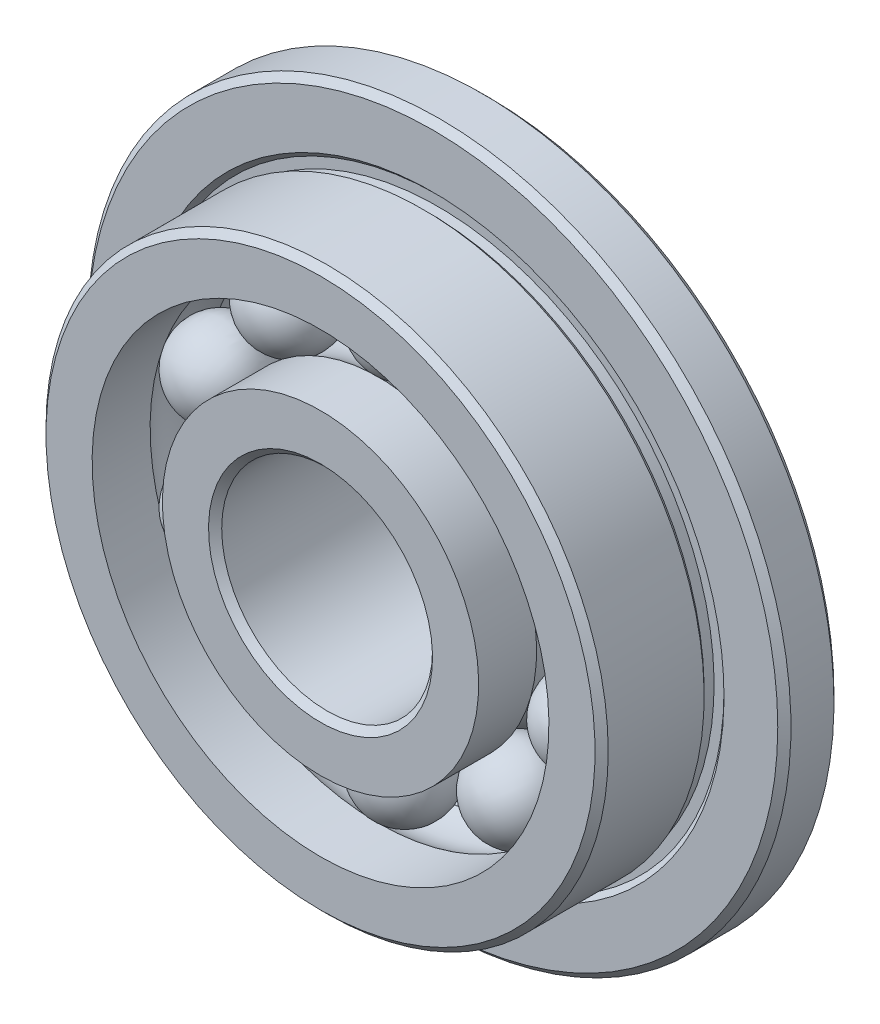
ISO-10303-21;
HEADER;
FILE_DESCRIPTION(('STEP AP214'),'2;1');
FILE_NAME('part.step','',(''),(''),'','','');
FILE_SCHEMA(('AUTOMOTIVE_DESIGN { 1 0 10303 214 1 1 1 1 }'));
ENDSEC;
DATA;
#1=APPLICATION_CONTEXT('core data for automotive mechanical design processes');
#2=APPLICATION_PROTOCOL_DEFINITION('international standard','automotive_design',2000,#1);
#3=PRODUCT_CONTEXT('',#1,'mechanical');
#4=PRODUCT('Part','Part','',(#3));
#5=PRODUCT_RELATED_PRODUCT_CATEGORY('part','',(#4));
#6=PRODUCT_DEFINITION_FORMATION('','',#4);
#7=PRODUCT_DEFINITION_CONTEXT('part definition',#1,'design');
#8=PRODUCT_DEFINITION('design','',#6,#7);
#9=PRODUCT_DEFINITION_SHAPE('','',#8);
#10=(LENGTH_UNIT() NAMED_UNIT(*) SI_UNIT(.MILLI.,.METRE.));
#11=(NAMED_UNIT(*) PLANE_ANGLE_UNIT() SI_UNIT($,.RADIAN.));
#12=(NAMED_UNIT(*) SI_UNIT($,.STERADIAN.) SOLID_ANGLE_UNIT());
#13=UNCERTAINTY_MEASURE_WITH_UNIT(LENGTH_MEASURE(1.E-05),#10,'distance_accuracy_value','');
#14=(GEOMETRIC_REPRESENTATION_CONTEXT(3) GLOBAL_UNCERTAINTY_ASSIGNED_CONTEXT((#13)) GLOBAL_UNIT_ASSIGNED_CONTEXT((#10,
#11,#12)) REPRESENTATION_CONTEXT('',''));
#15=CARTESIAN_POINT('',(0.,0.,0.));
#16=DIRECTION('',(0.,0.,1.));
#17=DIRECTION('',(1.,0.,0.));
#18=AXIS2_PLACEMENT_3D('',#15,#16,#17);
#19=CARTESIAN_POINT('',(-0.808204721902136,1.11239836726556,0.));
#20=DIRECTION('',(-0.587785252292463,0.809016994374955,0.));
#21=DIRECTION('',(0.809016994374955,0.587785252292463,0.));
#22=AXIS2_PLACEMENT_3D('',#19,#20,#21);
#23=SPHERICAL_SURFACE('',#22,0.3125);
#24=CARTESIAN_POINT('',(-0.99188761324353,1.36521617800774,0.));
#25=VERTEX_POINT('',#24);
#26=VERTEX_LOOP('',#25);
#27=FACE_BOUND('',#26,.T.);
#28=ADVANCED_FACE('F50',(#27),#23,.T.);
#29=CLOSED_SHELL('',(#28));
#30=MANIFOLD_SOLID_BREP('B2',#29);
#31=CARTESIAN_POINT('',(-1.30770270990583,0.424898367265568,0.));
#32=DIRECTION('',(-0.95105651629515,0.309016994374958,0.));
#33=DIRECTION('',(0.309016994374958,0.95105651629515,0.));
#34=AXIS2_PLACEMENT_3D('',#31,#32,#33);
#35=SPHERICAL_SURFACE('',#34,0.3125);
#36=CARTESIAN_POINT('',(-1.60490787124807,0.521466178007742,0.));
#37=VERTEX_POINT('',#36);
#38=VERTEX_LOOP('',#37);
#39=FACE_BOUND('',#38,.T.);
#40=ADVANCED_FACE('F71',(#39),#35,.T.);
#41=CLOSED_SHELL('',(#40));
#42=MANIFOLD_SOLID_BREP('B7',#41);
#43=CARTESIAN_POINT('',(-1.30770270990584,-0.42489836726554,0.));
#44=DIRECTION('',(-0.951056516295157,-0.309016994374938,0.));
#45=DIRECTION('',(-0.309016994374938,0.951056516295157,0.));
#46=AXIS2_PLACEMENT_3D('',#43,#44,#45);
#47=SPHERICAL_SURFACE('',#46,0.3125);
#48=CARTESIAN_POINT('',(-1.60490787124808,-0.521466178007708,0.));
#49=VERTEX_POINT('',#48);
#50=VERTEX_LOOP('',#49);
#51=FACE_BOUND('',#50,.T.);
#52=ADVANCED_FACE('F92',(#51),#47,.T.);
#53=CLOSED_SHELL('',(#52));
#54=MANIFOLD_SOLID_BREP('B46',#53);
#55=CARTESIAN_POINT('',(-0.80820472190216,-1.11239836726555,0.));
#56=DIRECTION('',(-0.58778525229248,-0.809016994374942,0.));
#57=DIRECTION('',(-0.809016994374942,0.58778525229248,0.));
#58=AXIS2_PLACEMENT_3D('',#55,#56,#57);
#59=SPHERICAL_SURFACE('',#58,0.3125);
#60=CARTESIAN_POINT('',(-0.99188761324356,-1.36521617800772,0.));
#61=VERTEX_POINT('',#60);
#62=VERTEX_LOOP('',#61);
#63=FACE_BOUND('',#62,.T.);
#64=ADVANCED_FACE('F113',(#63),#59,.T.);
#65=CLOSED_SHELL('',(#64));
#66=MANIFOLD_SOLID_BREP('B67',#65);
#67=CARTESIAN_POINT('',(0.,-1.375,0.));
#68=DIRECTION('',(0.,-1.,0.));
#69=DIRECTION('',(-1.,0.,0.));
#70=AXIS2_PLACEMENT_3D('',#67,#68,#69);
#71=SPHERICAL_SURFACE('',#70,0.3125);
#72=CARTESIAN_POINT('',(0.,-1.6875,0.));
#73=VERTEX_POINT('',#72);
#74=VERTEX_LOOP('',#73);
#75=FACE_BOUND('',#74,.T.);
#76=ADVANCED_FACE('F134',(#75),#71,.T.);
#77=CLOSED_SHELL('',(#76));
#78=MANIFOLD_SOLID_BREP('B88',#77);
#79=CARTESIAN_POINT('',(0.808204721902144,-1.11239836726556,0.));
#80=DIRECTION('',(0.587785252292469,-0.809016994374951,0.));
#81=DIRECTION('',(-0.809016994374951,-0.587785252292469,0.));
#82=AXIS2_PLACEMENT_3D('',#79,#80,#81);
#83=SPHERICAL_SURFACE('',#82,0.3125);
#84=CARTESIAN_POINT('',(0.991887613243541,-1.36521617800773,0.));
#85=VERTEX_POINT('',#84);
#86=VERTEX_LOOP('',#85);
#87=FACE_BOUND('',#86,.T.);
#88=ADVANCED_FACE('F155',(#87),#83,.T.);
#89=CLOSED_SHELL('',(#88));
#90=MANIFOLD_SOLID_BREP('B109',#89);
#91=CARTESIAN_POINT('',(1.30770270990583,-0.424898367265558,0.));
#92=DIRECTION('',(0.951056516295152,-0.309016994374952,0.));
#93=DIRECTION('',(-0.309016994374952,-0.951056516295152,0.));
#94=AXIS2_PLACEMENT_3D('',#91,#92,#93);
#95=SPHERICAL_SURFACE('',#94,0.3125);
#96=CARTESIAN_POINT('',(1.60490787124807,-0.521466178007731,0.));
#97=VERTEX_POINT('',#96);
#98=VERTEX_LOOP('',#97);
#99=FACE_BOUND('',#98,.T.);
#100=ADVANCED_FACE('F176',(#99),#95,.T.);
#101=CLOSED_SHELL('',(#100));
#102=MANIFOLD_SOLID_BREP('B130',#101);
#103=CARTESIAN_POINT('',(1.30770270990584,0.424898367265549,0.));
#104=DIRECTION('',(0.951056516295155,0.309016994374945,0.));
#105=DIRECTION('',(0.309016994374945,-0.951056516295155,0.));
#106=AXIS2_PLACEMENT_3D('',#103,#104,#105);
#107=SPHERICAL_SURFACE('',#106,0.3125);
#108=CARTESIAN_POINT('',(1.60490787124807,0.521466178007719,0.));
#109=VERTEX_POINT('',#108);
#110=VERTEX_LOOP('',#109);
#111=FACE_BOUND('',#110,.T.);
#112=ADVANCED_FACE('F197',(#111),#107,.T.);
#113=CLOSED_SHELL('',(#112));
#114=MANIFOLD_SOLID_BREP('B151',#113);
#115=CARTESIAN_POINT('',(0.808204721902152,1.11239836726555,0.));
#116=DIRECTION('',(0.587785252292474,0.809016994374947,0.));
#117=DIRECTION('',(0.809016994374947,-0.587785252292474,0.));
#118=AXIS2_PLACEMENT_3D('',#115,#116,#117);
#119=SPHERICAL_SURFACE('',#118,0.3125);
#120=CARTESIAN_POINT('',(0.99188761324355,1.36521617800772,0.));
#121=VERTEX_POINT('',#120);
#122=VERTEX_LOOP('',#121);
#123=FACE_BOUND('',#122,.T.);
#124=ADVANCED_FACE('F218',(#123),#119,.T.);
#125=CLOSED_SHELL('',(#124));
#126=MANIFOLD_SOLID_BREP('B172',#125);
#127=CARTESIAN_POINT('',(0.,1.375,0.));
#128=DIRECTION('',(0.,1.,0.));
#129=DIRECTION('',(1.,0.,0.));
#130=AXIS2_PLACEMENT_3D('',#127,#128,#129);
#131=SPHERICAL_SURFACE('',#130,0.3125);
#132=CARTESIAN_POINT('',(0.,1.6875,0.));
#133=VERTEX_POINT('',#132);
#134=VERTEX_LOOP('',#133);
#135=FACE_BOUND('',#134,.T.);
#136=ADVANCED_FACE('F242',(#135),#131,.T.);
#137=CLOSED_SHELL('',(#136));
#138=MANIFOLD_SOLID_BREP('B193',#137);
#139=CARTESIAN_POINT('',(0.,0.,0.));
#140=DIRECTION('',(0.,0.,1.));
#141=DIRECTION('',(0.,-1.,0.));
#142=AXIS2_PLACEMENT_3D('',#139,#140,#141);
#143=CYLINDRICAL_SURFACE('',#142,1.125);
#144=CARTESIAN_POINT('',(0.,0.,-0.1875));
#145=DIRECTION('',(0.,0.,1.));
#146=DIRECTION('',(0.,-1.,0.));
#147=AXIS2_PLACEMENT_3D('',#144,#145,#146);
#148=CIRCLE('',#147,1.125);
#149=CARTESIAN_POINT('',(0.,-1.125,-0.1875));
#150=VERTEX_POINT('',#149);
#151=EDGE_CURVE('E290',#150,#150,#148,.T.);
#152=ORIENTED_EDGE('',*,*,#151,.F.);
#153=EDGE_LOOP('',(#152));
#154=FACE_BOUND('',#153,.T.);
#155=CARTESIAN_POINT('',(0.,0.,-0.600000000000001));
#156=DIRECTION('',(0.,0.,1.));
#157=DIRECTION('',(0.,-1.,0.));
#158=AXIS2_PLACEMENT_3D('',#155,#156,#157);
#159=CIRCLE('',#158,1.125);
#160=CARTESIAN_POINT('',(0.,-1.125,-0.600000000000001));
#161=VERTEX_POINT('',#160);
#162=EDGE_CURVE('E302',#161,#161,#159,.T.);
#163=ORIENTED_EDGE('',*,*,#162,.T.);
#164=EDGE_LOOP('',(#163));
#165=FACE_BOUND('',#164,.T.);
#166=ADVANCED_FACE('F264',(#154,#165),#143,.T.);
#167=CARTESIAN_POINT('',(0.,0.,0.));
#168=DIRECTION('',(0.,0.,1.));
#169=DIRECTION('',(0.,-1.,0.));
#170=AXIS2_PLACEMENT_3D('',#167,#168,#169);
#171=TOROIDAL_SURFACE('',#170,1.375,0.3125);
#172=CARTESIAN_POINT('',(0.,0.,0.1875));
#173=DIRECTION('',(0.,0.,1.));
#174=DIRECTION('',(0.,-1.,0.));
#175=AXIS2_PLACEMENT_3D('',#172,#173,#174);
#176=CIRCLE('',#175,1.125);
#177=CARTESIAN_POINT('',(0.,-1.125,0.1875));
#178=VERTEX_POINT('',#177);
#179=EDGE_CURVE('E294',#178,#178,#176,.T.);
#180=ORIENTED_EDGE('',*,*,#179,.F.);
#181=EDGE_LOOP('',(#180));
#182=FACE_BOUND('',#181,.T.);
#183=ORIENTED_EDGE('',*,*,#151,.T.);
#184=EDGE_LOOP('',(#183));
#185=FACE_BOUND('',#184,.T.);
#186=ADVANCED_FACE('F323',(#182,#185),#171,.F.);
#187=CARTESIAN_POINT('',(0.,0.,0.));
#188=DIRECTION('',(0.,0.,1.));
#189=DIRECTION('',(0.,-1.,0.));
#190=AXIS2_PLACEMENT_3D('',#187,#188,#189);
#191=CYLINDRICAL_SURFACE('',#190,1.125);
#192=CARTESIAN_POINT('',(0.,0.,0.6));
#193=DIRECTION('',(0.,0.,1.));
#194=DIRECTION('',(0.,-1.,0.));
#195=AXIS2_PLACEMENT_3D('',#192,#193,#194);
#196=CIRCLE('',#195,1.125);
#197=CARTESIAN_POINT('',(0.,-1.125,0.6));
#198=VERTEX_POINT('',#197);
#199=EDGE_CURVE('E298',#198,#198,#196,.T.);
#200=ORIENTED_EDGE('',*,*,#199,.F.);
#201=EDGE_LOOP('',(#200));
#202=FACE_BOUND('',#201,.T.);
#203=ORIENTED_EDGE('',*,*,#179,.T.);
#204=EDGE_LOOP('',(#203));
#205=FACE_BOUND('',#204,.T.);
#206=ADVANCED_FACE('F329',(#202,#205),#191,.T.);
#207=CARTESIAN_POINT('',(0.,0.75,0.6));
#208=DIRECTION('',(0.,0.,-1.));
#209=DIRECTION('',(0.,1.,0.));
#210=AXIS2_PLACEMENT_3D('',#207,#208,#209);
#211=PLANE('',#210);
#212=CARTESIAN_POINT('',(0.,0.,0.6));
#213=DIRECTION('',(0.,0.,-1.));
#214=DIRECTION('',(0.,1.,0.));
#215=AXIS2_PLACEMENT_3D('',#212,#213,#214);
#216=CIRCLE('',#215,0.796875);
#217=CARTESIAN_POINT('',(0.,0.796875,0.6));
#218=VERTEX_POINT('',#217);
#219=EDGE_CURVE('E241',#218,#218,#216,.T.);
#220=ORIENTED_EDGE('',*,*,#219,.T.);
#221=EDGE_LOOP('',(#220));
#222=FACE_BOUND('',#221,.T.);
#223=ORIENTED_EDGE('',*,*,#199,.T.);
#224=EDGE_LOOP('',(#223));
#225=FACE_BOUND('',#224,.T.);
#226=ADVANCED_FACE('F320',(#222,#225),#211,.F.);
#227=CARTESIAN_POINT('',(0.,0.,0.));
#228=DIRECTION('',(0.,0.,1.));
#229=DIRECTION('',(0.,-1.,0.));
#230=AXIS2_PLACEMENT_3D('',#227,#228,#229);
#231=CYLINDRICAL_SURFACE('',#230,0.75);
#232=CARTESIAN_POINT('',(0.,0.,-0.553125));
#233=DIRECTION('',(0.,0.,1.));
#234=DIRECTION('',(0.,-1.,0.));
#235=AXIS2_PLACEMENT_3D('',#232,#233,#234);
#236=CIRCLE('',#235,0.75);
#237=CARTESIAN_POINT('',(0.,-0.75,-0.553125));
#238=VERTEX_POINT('',#237);
#239=EDGE_CURVE('E272',#238,#238,#236,.F.);
#240=ORIENTED_EDGE('',*,*,#239,.T.);
#241=EDGE_LOOP('',(#240));
#242=FACE_BOUND('',#241,.T.);
#243=CARTESIAN_POINT('',(0.,0.,0.553125));
#244=DIRECTION('',(0.,0.,-1.));
#245=DIRECTION('',(0.,1.,0.));
#246=AXIS2_PLACEMENT_3D('',#243,#244,#245);
#247=CIRCLE('',#246,0.75);
#248=CARTESIAN_POINT('',(0.,0.75,0.553125));
#249=VERTEX_POINT('',#248);
#250=EDGE_CURVE('E278',#249,#249,#247,.F.);
#251=ORIENTED_EDGE('',*,*,#250,.T.);
#252=EDGE_LOOP('',(#251));
#253=FACE_BOUND('',#252,.T.);
#254=ADVANCED_FACE('F312',(#242,#253),#231,.F.);
#255=CARTESIAN_POINT('',(0.,1.125,-0.600000000000001));
#256=DIRECTION('',(0.,0.,1.));
#257=DIRECTION('',(0.,-1.,0.));
#258=AXIS2_PLACEMENT_3D('',#255,#256,#257);
#259=PLANE('',#258);
#260=CARTESIAN_POINT('',(0.,0.,-0.6));
#261=DIRECTION('',(0.,0.,1.));
#262=DIRECTION('',(0.,-1.,0.));
#263=AXIS2_PLACEMENT_3D('',#260,#261,#262);
#264=CIRCLE('',#263,0.796875);
#265=CARTESIAN_POINT('',(0.,-0.796875,-0.6));
#266=VERTEX_POINT('',#265);
#267=EDGE_CURVE('E284',#266,#266,#264,.T.);
#268=ORIENTED_EDGE('',*,*,#267,.T.);
#269=EDGE_LOOP('',(#268));
#270=FACE_BOUND('',#269,.T.);
#271=ORIENTED_EDGE('',*,*,#162,.F.);
#272=EDGE_LOOP('',(#271));
#273=FACE_BOUND('',#272,.T.);
#274=ADVANCED_FACE('F309',(#270,#273),#259,.F.);
#275=CARTESIAN_POINT('',(0.,0.,-0.6));
#276=DIRECTION('',(0.,0.,-1.));
#277=DIRECTION('',(0.,1.,0.));
#278=AXIS2_PLACEMENT_3D('',#275,#276,#277);
#279=CONICAL_SURFACE('',#278,0.796875,0.785398163397448);
#280=ORIENTED_EDGE('',*,*,#239,.F.);
#281=EDGE_LOOP('',(#280));
#282=FACE_BOUND('',#281,.T.);
#283=ORIENTED_EDGE('',*,*,#267,.F.);
#284=EDGE_LOOP('',(#283));
#285=FACE_BOUND('',#284,.T.);
#286=ADVANCED_FACE('F311',(#282,#285),#279,.F.);
#287=CARTESIAN_POINT('',(0.,0.,0.553125));
#288=DIRECTION('',(0.,0.,1.));
#289=DIRECTION('',(0.,-1.,0.));
#290=AXIS2_PLACEMENT_3D('',#287,#288,#289);
#291=CONICAL_SURFACE('',#290,0.75,0.785398163397448);
#292=ORIENTED_EDGE('',*,*,#219,.F.);
#293=EDGE_LOOP('',(#292));
#294=FACE_BOUND('',#293,.T.);
#295=ORIENTED_EDGE('',*,*,#250,.F.);
#296=EDGE_LOOP('',(#295));
#297=FACE_BOUND('',#296,.T.);
#298=ADVANCED_FACE('F266',(#294,#297),#291,.F.);
#299=CLOSED_SHELL('',(#166,#186,#206,#226,#254,#274,#286,#298));
#300=MANIFOLD_SOLID_BREP('B214',#299);
#301=CARTESIAN_POINT('',(0.,1.625,-0.600000000000001));
#302=DIRECTION('',(0.,0.,1.));
#303=DIRECTION('',(0.,-1.,0.));
#304=AXIS2_PLACEMENT_3D('',#301,#302,#303);
#305=PLANE('',#304);
#306=CARTESIAN_POINT('',(0.,0.,-0.600000000000001));
#307=DIRECTION('',(0.,0.,1.));
#308=DIRECTION('',(0.,-1.,0.));
#309=AXIS2_PLACEMENT_3D('',#306,#307,#308);
#310=CIRCLE('',#309,2.453125);
#311=CARTESIAN_POINT('',(0.,-2.453125,-0.6));
#312=VERTEX_POINT('',#311);
#313=EDGE_CURVE('E423',#312,#312,#310,.F.);
#314=ORIENTED_EDGE('',*,*,#313,.T.);
#315=EDGE_LOOP('',(#314));
#316=FACE_BOUND('',#315,.T.);
#317=CARTESIAN_POINT('',(0.,0.,-0.600000000000001));
#318=DIRECTION('',(0.,0.,1.));
#319=DIRECTION('',(0.,-1.,0.));
#320=AXIS2_PLACEMENT_3D('',#317,#318,#319);
#321=CIRCLE('',#320,1.625);
#322=CARTESIAN_POINT('',(0.,-1.625,-0.600000000000001));
#323=VERTEX_POINT('',#322);
#324=EDGE_CURVE('E437',#323,#323,#321,.T.);
#325=ORIENTED_EDGE('',*,*,#324,.T.);
#326=EDGE_LOOP('',(#325));
#327=FACE_BOUND('',#326,.T.);
#328=ADVANCED_FACE('F403',(#316,#327),#305,.F.);
#329=CARTESIAN_POINT('',(0.,0.,0.));
#330=DIRECTION('',(0.,0.,1.));
#331=DIRECTION('',(0.,-1.,0.));
#332=AXIS2_PLACEMENT_3D('',#329,#330,#331);
#333=CYLINDRICAL_SURFACE('',#332,1.625);
#334=ORIENTED_EDGE('',*,*,#324,.F.);
#335=EDGE_LOOP('',(#334));
#336=FACE_BOUND('',#335,.T.);
#337=CARTESIAN_POINT('',(0.,0.,-0.1875));
#338=DIRECTION('',(0.,0.,1.));
#339=DIRECTION('',(0.,-1.,0.));
#340=AXIS2_PLACEMENT_3D('',#337,#338,#339);
#341=CIRCLE('',#340,1.625);
#342=CARTESIAN_POINT('',(0.,-1.625,-0.1875));
#343=VERTEX_POINT('',#342);
#344=EDGE_CURVE('E441',#343,#343,#341,.T.);
#345=ORIENTED_EDGE('',*,*,#344,.T.);
#346=EDGE_LOOP('',(#345));
#347=FACE_BOUND('',#346,.T.);
#348=ADVANCED_FACE('F493',(#336,#347),#333,.F.);
#349=CARTESIAN_POINT('',(0.,0.,0.));
#350=DIRECTION('',(0.,0.,1.));
#351=DIRECTION('',(0.,-1.,0.));
#352=AXIS2_PLACEMENT_3D('',#349,#350,#351);
#353=TOROIDAL_SURFACE('',#352,1.375,0.3125);
#354=ORIENTED_EDGE('',*,*,#344,.F.);
#355=EDGE_LOOP('',(#354));
#356=FACE_BOUND('',#355,.T.);
#357=CARTESIAN_POINT('',(0.,0.,0.1875));
#358=DIRECTION('',(0.,0.,1.));
#359=DIRECTION('',(0.,-1.,0.));
#360=AXIS2_PLACEMENT_3D('',#357,#358,#359);
#361=CIRCLE('',#360,1.625);
#362=CARTESIAN_POINT('',(0.,-1.625,0.1875));
#363=VERTEX_POINT('',#362);
#364=EDGE_CURVE('E445',#363,#363,#361,.T.);
#365=ORIENTED_EDGE('',*,*,#364,.T.);
#366=EDGE_LOOP('',(#365));
#367=FACE_BOUND('',#366,.T.);
#368=ADVANCED_FACE('F499',(#356,#367),#353,.F.);
#369=CARTESIAN_POINT('',(0.,0.,0.));
#370=DIRECTION('',(0.,0.,1.));
#371=DIRECTION('',(0.,-1.,0.));
#372=AXIS2_PLACEMENT_3D('',#369,#370,#371);
#373=CYLINDRICAL_SURFACE('',#372,1.625);
#374=ORIENTED_EDGE('',*,*,#364,.F.);
#375=EDGE_LOOP('',(#374));
#376=FACE_BOUND('',#375,.T.);
#377=CARTESIAN_POINT('',(0.,0.,0.6));
#378=DIRECTION('',(0.,0.,1.));
#379=DIRECTION('',(0.,-1.,0.));
#380=AXIS2_PLACEMENT_3D('',#377,#378,#379);
#381=CIRCLE('',#380,1.625);
#382=CARTESIAN_POINT('',(0.,-1.625,0.6));
#383=VERTEX_POINT('',#382);
#384=EDGE_CURVE('E449',#383,#383,#381,.T.);
#385=ORIENTED_EDGE('',*,*,#384,.T.);
#386=EDGE_LOOP('',(#385));
#387=FACE_BOUND('',#386,.T.);
#388=ADVANCED_FACE('F563',(#376,#387),#373,.F.);
#389=CARTESIAN_POINT('',(0.,2.,0.6));
#390=DIRECTION('',(0.,0.,-1.));
#391=DIRECTION('',(0.,1.,0.));
#392=AXIS2_PLACEMENT_3D('',#389,#390,#391);
#393=PLANE('',#392);
#394=CARTESIAN_POINT('',(0.,0.,0.6));
#395=DIRECTION('',(0.,0.,-1.));
#396=DIRECTION('',(0.,1.,0.));
#397=AXIS2_PLACEMENT_3D('',#394,#395,#396);
#398=CIRCLE('',#397,1.953125);
#399=CARTESIAN_POINT('',(0.,1.953125,0.6));
#400=VERTEX_POINT('',#399);
#401=EDGE_CURVE('E411',#400,#400,#398,.F.);
#402=ORIENTED_EDGE('',*,*,#401,.T.);
#403=EDGE_LOOP('',(#402));
#404=FACE_BOUND('',#403,.T.);
#405=ORIENTED_EDGE('',*,*,#384,.F.);
#406=EDGE_LOOP('',(#405));
#407=FACE_BOUND('',#406,.T.);
#408=ADVANCED_FACE('F553',(#404,#407),#393,.F.);
#409=CARTESIAN_POINT('',(0.,0.,0.));
#410=DIRECTION('',(0.,0.,1.));
#411=DIRECTION('',(0.,-1.,0.));
#412=AXIS2_PLACEMENT_3D('',#409,#410,#411);
#413=CYLINDRICAL_SURFACE('',#412,2.);
#414=CARTESIAN_POINT('',(0.,0.,0.553125));
#415=DIRECTION('',(0.,0.,-1.));
#416=DIRECTION('',(0.,1.,0.));
#417=AXIS2_PLACEMENT_3D('',#414,#415,#416);
#418=CIRCLE('',#417,2.);
#419=CARTESIAN_POINT('',(0.,2.,0.553125));
#420=VERTEX_POINT('',#419);
#421=EDGE_CURVE('E263',#420,#420,#418,.T.);
#422=ORIENTED_EDGE('',*,*,#421,.T.);
#423=EDGE_LOOP('',(#422));
#424=FACE_BOUND('',#423,.T.);
#425=CARTESIAN_POINT('',(0.,0.,-0.129289321881347));
#426=DIRECTION('',(0.,0.,1.));
#427=DIRECTION('',(0.,-1.,0.));
#428=AXIS2_PLACEMENT_3D('',#425,#426,#427);
#429=CIRCLE('',#428,2.);
#430=CARTESIAN_POINT('',(0.,-2.,-0.129289321881346));
#431=VERTEX_POINT('',#430);
#432=EDGE_CURVE('E453',#431,#431,#429,.T.);
#433=ORIENTED_EDGE('',*,*,#432,.T.);
#434=EDGE_LOOP('',(#433));
#435=FACE_BOUND('',#434,.T.);
#436=ADVANCED_FACE('F547',(#424,#435),#413,.T.);
#437=CARTESIAN_POINT('',(0.,0.,-0.164644660940673));
#438=DIRECTION('',(0.,0.,1.));
#439=DIRECTION('',(0.,-1.,0.));
#440=AXIS2_PLACEMENT_3D('',#437,#438,#439);
#441=CONICAL_SURFACE('',#440,1.96464466094067,0.785398163397446);
#442=ORIENTED_EDGE('',*,*,#432,.F.);
#443=EDGE_LOOP('',(#442));
#444=FACE_BOUND('',#443,.T.);
#445=CARTESIAN_POINT('',(0.,0.,-0.164644660940673));
#446=DIRECTION('',(0.,0.,1.));
#447=DIRECTION('',(0.,-1.,0.));
#448=AXIS2_PLACEMENT_3D('',#445,#446,#447);
#449=CIRCLE('',#448,1.96464466094067);
#450=CARTESIAN_POINT('',(0.,-1.96464466094067,-0.164644660940673));
#451=VERTEX_POINT('',#450);
#452=EDGE_CURVE('E457',#451,#451,#449,.T.);
#453=ORIENTED_EDGE('',*,*,#452,.T.);
#454=EDGE_LOOP('',(#453));
#455=FACE_BOUND('',#454,.T.);
#456=ADVANCED_FACE('F552',(#444,#455),#441,.T.);
#457=CARTESIAN_POINT('',(0.,0.,0.));
#458=DIRECTION('',(0.,0.,1.));
#459=DIRECTION('',(0.,-1.,0.));
#460=AXIS2_PLACEMENT_3D('',#457,#458,#459);
#461=CYLINDRICAL_SURFACE('',#460,1.96464466094067);
#462=ORIENTED_EDGE('',*,*,#452,.F.);
#463=EDGE_LOOP('',(#462));
#464=FACE_BOUND('',#463,.T.);
#465=CARTESIAN_POINT('',(0.,0.,-0.235355339059328));
#466=DIRECTION('',(0.,0.,1.));
#467=DIRECTION('',(0.,-1.,0.));
#468=AXIS2_PLACEMENT_3D('',#465,#466,#467);
#469=CIRCLE('',#468,1.96464466094067);
#470=CARTESIAN_POINT('',(0.,-1.96464466094067,-0.235355339059328));
#471=VERTEX_POINT('',#470);
#472=EDGE_CURVE('E461',#471,#471,#469,.T.);
#473=ORIENTED_EDGE('',*,*,#472,.T.);
#474=EDGE_LOOP('',(#473));
#475=FACE_BOUND('',#474,.T.);
#476=ADVANCED_FACE('F585',(#464,#475),#461,.T.);
#477=CARTESIAN_POINT('',(0.,2.03535533905933,-0.235355339059328));
#478=DIRECTION('',(0.,0.,-1.));
#479=DIRECTION('',(0.,1.,0.));
#480=AXIS2_PLACEMENT_3D('',#477,#478,#479);
#481=PLANE('',#480);
#482=ORIENTED_EDGE('',*,*,#472,.F.);
#483=EDGE_LOOP('',(#482));
#484=FACE_BOUND('',#483,.T.);
#485=CARTESIAN_POINT('',(0.,0.,-0.235355339059328));
#486=DIRECTION('',(0.,0.,1.));
#487=DIRECTION('',(0.,-1.,0.));
#488=AXIS2_PLACEMENT_3D('',#485,#486,#487);
#489=CIRCLE('',#488,2.03535533905933);
#490=CARTESIAN_POINT('',(0.,-2.03535533905933,-0.235355339059328));
#491=VERTEX_POINT('',#490);
#492=EDGE_CURVE('E465',#491,#491,#489,.T.);
#493=ORIENTED_EDGE('',*,*,#492,.T.);
#494=EDGE_LOOP('',(#493));
#495=FACE_BOUND('',#494,.T.);
#496=ADVANCED_FACE('F489',(#484,#495),#481,.F.);
#497=CARTESIAN_POINT('',(0.,0.,-0.200000000000001));
#498=DIRECTION('',(0.,0.,1.));
#499=DIRECTION('',(0.,-1.,0.));
#500=AXIS2_PLACEMENT_3D('',#497,#498,#499);
#501=CONICAL_SURFACE('',#500,2.07071067811866,0.78539816339746);
#502=ORIENTED_EDGE('',*,*,#492,.F.);
#503=EDGE_LOOP('',(#502));
#504=FACE_BOUND('',#503,.T.);
#505=CARTESIAN_POINT('',(0.,0.,-0.200000000000001));
#506=DIRECTION('',(0.,0.,1.));
#507=DIRECTION('',(0.,-1.,0.));
#508=AXIS2_PLACEMENT_3D('',#505,#506,#507);
#509=CIRCLE('',#508,2.07071067811866);
#510=CARTESIAN_POINT('',(0.,-2.07071067811866,-0.2));
#511=VERTEX_POINT('',#510);
#512=EDGE_CURVE('E469',#511,#511,#509,.T.);
#513=ORIENTED_EDGE('',*,*,#512,.T.);
#514=EDGE_LOOP('',(#513));
#515=FACE_BOUND('',#514,.T.);
#516=ADVANCED_FACE('F475',(#504,#515),#501,.F.);
#517=CARTESIAN_POINT('',(0.,2.5,-0.200000000000001));
#518=DIRECTION('',(0.,0.,-1.));
#519=DIRECTION('',(0.,1.,0.));
#520=AXIS2_PLACEMENT_3D('',#517,#518,#519);
#521=PLANE('',#520);
#522=CARTESIAN_POINT('',(0.,0.,-0.200000000000001));
#523=DIRECTION('',(0.,0.,-1.));
#524=DIRECTION('',(0.,1.,0.));
#525=AXIS2_PLACEMENT_3D('',#522,#523,#524);
#526=CIRCLE('',#525,2.453125);
#527=CARTESIAN_POINT('',(0.,2.453125,-0.200000000000001));
#528=VERTEX_POINT('',#527);
#529=EDGE_CURVE('E417',#528,#528,#526,.F.);
#530=ORIENTED_EDGE('',*,*,#529,.T.);
#531=EDGE_LOOP('',(#530));
#532=FACE_BOUND('',#531,.T.);
#533=ORIENTED_EDGE('',*,*,#512,.F.);
#534=EDGE_LOOP('',(#533));
#535=FACE_BOUND('',#534,.T.);
#536=ADVANCED_FACE('F477',(#532,#535),#521,.F.);
#537=CARTESIAN_POINT('',(0.,0.,0.));
#538=DIRECTION('',(0.,0.,1.));
#539=DIRECTION('',(0.,-1.,0.));
#540=AXIS2_PLACEMENT_3D('',#537,#538,#539);
#541=CYLINDRICAL_SURFACE('',#540,2.5);
#542=CARTESIAN_POINT('',(0.,0.,-0.553125000000001));
#543=DIRECTION('',(0.,0.,1.));
#544=DIRECTION('',(0.,-1.,0.));
#545=AXIS2_PLACEMENT_3D('',#542,#543,#544);
#546=CIRCLE('',#545,2.5);
#547=CARTESIAN_POINT('',(0.,-2.5,-0.553125));
#548=VERTEX_POINT('',#547);
#549=EDGE_CURVE('E429',#548,#548,#546,.T.);
#550=ORIENTED_EDGE('',*,*,#549,.T.);
#551=EDGE_LOOP('',(#550));
#552=FACE_BOUND('',#551,.T.);
#553=CARTESIAN_POINT('',(0.,0.,-0.246875000000001));
#554=DIRECTION('',(0.,0.,-1.));
#555=DIRECTION('',(0.,1.,0.));
#556=AXIS2_PLACEMENT_3D('',#553,#554,#555);
#557=CIRCLE('',#556,2.5);
#558=CARTESIAN_POINT('',(0.,2.5,-0.246875000000001));
#559=VERTEX_POINT('',#558);
#560=EDGE_CURVE('E433',#559,#559,#557,.T.);
#561=ORIENTED_EDGE('',*,*,#560,.T.);
#562=EDGE_LOOP('',(#561));
#563=FACE_BOUND('',#562,.T.);
#564=ADVANCED_FACE('F479',(#552,#563),#541,.T.);
#565=CARTESIAN_POINT('',(0.,0.,-0.553125000000001));
#566=DIRECTION('',(0.,0.,1.));
#567=DIRECTION('',(0.,-1.,0.));
#568=AXIS2_PLACEMENT_3D('',#565,#566,#567);
#569=CONICAL_SURFACE('',#568,2.5,0.785398163397448);
#570=ORIENTED_EDGE('',*,*,#313,.F.);
#571=EDGE_LOOP('',(#570));
#572=FACE_BOUND('',#571,.T.);
#573=ORIENTED_EDGE('',*,*,#549,.F.);
#574=EDGE_LOOP('',(#573));
#575=FACE_BOUND('',#574,.T.);
#576=ADVANCED_FACE('F486',(#572,#575),#569,.T.);
#577=CARTESIAN_POINT('',(0.,0.,-0.200000000000001));
#578=DIRECTION('',(0.,0.,-1.));
#579=DIRECTION('',(0.,1.,0.));
#580=AXIS2_PLACEMENT_3D('',#577,#578,#579);
#581=CONICAL_SURFACE('',#580,2.453125,0.785398163397449);
#582=ORIENTED_EDGE('',*,*,#560,.F.);
#583=EDGE_LOOP('',(#582));
#584=FACE_BOUND('',#583,.T.);
#585=ORIENTED_EDGE('',*,*,#529,.F.);
#586=EDGE_LOOP('',(#585));
#587=FACE_BOUND('',#586,.T.);
#588=ADVANCED_FACE('F506',(#584,#587),#581,.T.);
#589=CARTESIAN_POINT('',(0.,0.,0.6));
#590=DIRECTION('',(0.,0.,-1.));
#591=DIRECTION('',(0.,1.,0.));
#592=AXIS2_PLACEMENT_3D('',#589,#590,#591);
#593=CONICAL_SURFACE('',#592,1.953125,0.785398163397448);
#594=ORIENTED_EDGE('',*,*,#421,.F.);
#595=EDGE_LOOP('',(#594));
#596=FACE_BOUND('',#595,.T.);
#597=ORIENTED_EDGE('',*,*,#401,.F.);
#598=EDGE_LOOP('',(#597));
#599=FACE_BOUND('',#598,.T.);
#600=ADVANCED_FACE('F405',(#596,#599),#593,.T.);
#601=CLOSED_SHELL('',(#328,#348,#368,#388,#408,#436,#456,#476,#496,#516,#536,#564,#576,#588,#600));
#602=MANIFOLD_SOLID_BREP('B236',#601);
#603=ADVANCED_BREP_SHAPE_REPRESENTATION('',(#18,#30,#42,#54,#66,#78,#90,#102,#114,#126,#138,
#300,#602),#14);
#604=SHAPE_DEFINITION_REPRESENTATION(#9,#603);
ENDSEC;
END-ISO-10303-21;
